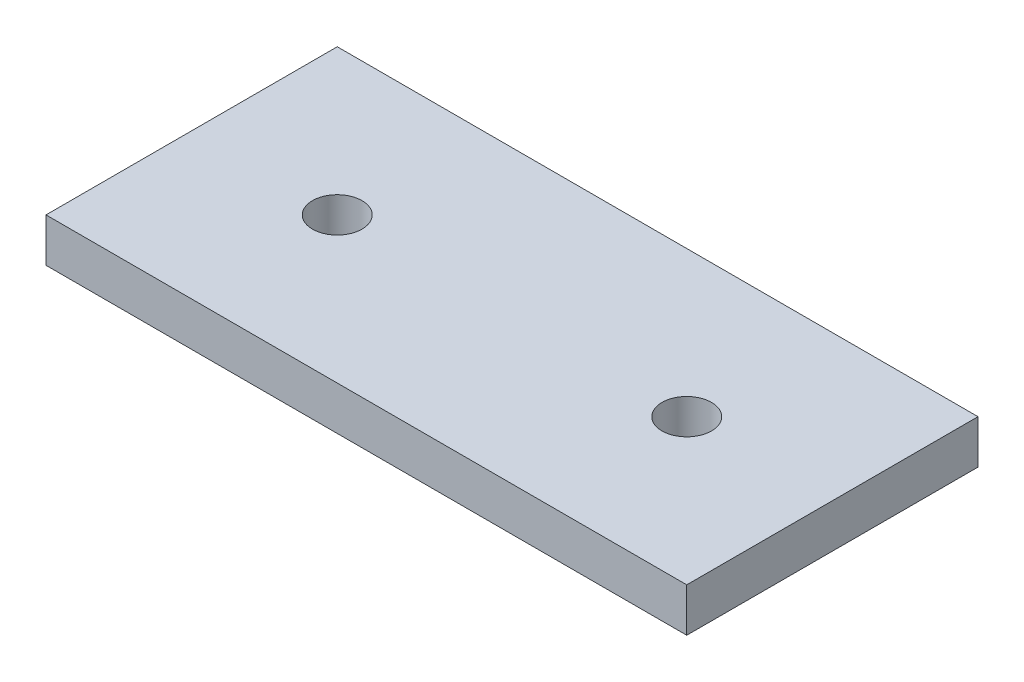
ISO-10303-21;
HEADER;
FILE_DESCRIPTION(('STEP AP214'),'2;1');
FILE_NAME('part.step','',(''),(''),'','','');
FILE_SCHEMA(('AUTOMOTIVE_DESIGN { 1 0 10303 214 1 1 1 1 }'));
ENDSEC;
DATA;
#1=APPLICATION_CONTEXT('core data for automotive mechanical design processes');
#2=APPLICATION_PROTOCOL_DEFINITION('international standard','automotive_design',2000,#1);
#3=PRODUCT_CONTEXT('',#1,'mechanical');
#4=PRODUCT('Part','Part','',(#3));
#5=PRODUCT_RELATED_PRODUCT_CATEGORY('part','',(#4));
#6=PRODUCT_DEFINITION_FORMATION('','',#4);
#7=PRODUCT_DEFINITION_CONTEXT('part definition',#1,'design');
#8=PRODUCT_DEFINITION('design','',#6,#7);
#9=PRODUCT_DEFINITION_SHAPE('','',#8);
#10=(LENGTH_UNIT() NAMED_UNIT(*) SI_UNIT(.MILLI.,.METRE.));
#11=(NAMED_UNIT(*) PLANE_ANGLE_UNIT() SI_UNIT($,.RADIAN.));
#12=(NAMED_UNIT(*) SI_UNIT($,.STERADIAN.) SOLID_ANGLE_UNIT());
#13=UNCERTAINTY_MEASURE_WITH_UNIT(LENGTH_MEASURE(1.E-05),#10,'distance_accuracy_value','');
#14=(GEOMETRIC_REPRESENTATION_CONTEXT(3) GLOBAL_UNCERTAINTY_ASSIGNED_CONTEXT((#13)) GLOBAL_UNIT_ASSIGNED_CONTEXT((#10,
#11,#12)) REPRESENTATION_CONTEXT('',''));
#15=CARTESIAN_POINT('',(0.,0.,0.));
#16=DIRECTION('',(0.,0.,1.));
#17=DIRECTION('',(1.,0.,0.));
#18=AXIS2_PLACEMENT_3D('',#15,#16,#17);
#19=CARTESIAN_POINT('',(-22.,3.,10.));
#20=DIRECTION('',(1.,0.,0.));
#21=DIRECTION('',(0.,0.,-1.));
#22=AXIS2_PLACEMENT_3D('',#19,#20,#21);
#23=PLANE('',#22);
#24=DIRECTION('',(0.,0.,1.));
#25=VECTOR('',#24,1.);
#26=CARTESIAN_POINT('',(-22.,0.,10.));
#27=LINE('',#26,#25);
#28=CARTESIAN_POINT('',(-22.,0.,-10.));
#29=VERTEX_POINT('',#28);
#30=CARTESIAN_POINT('',(-22.,0.,10.));
#31=VERTEX_POINT('',#30);
#32=EDGE_CURVE('E105',#29,#31,#27,.T.);
#33=ORIENTED_EDGE('',*,*,#32,.T.);
#34=DIRECTION('',(0.,-1.,0.));
#35=VECTOR('',#34,1.);
#36=CARTESIAN_POINT('',(-22.,3.,10.));
#37=LINE('',#36,#35);
#38=CARTESIAN_POINT('',(-22.,3.,10.));
#39=VERTEX_POINT('',#38);
#40=EDGE_CURVE('E11',#39,#31,#37,.T.);
#41=ORIENTED_EDGE('',*,*,#40,.F.);
#42=DIRECTION('',(0.,0.,1.));
#43=VECTOR('',#42,1.);
#44=CARTESIAN_POINT('',(-22.,3.,10.));
#45=LINE('',#44,#43);
#46=CARTESIAN_POINT('',(-22.,3.,-10.));
#47=VERTEX_POINT('',#46);
#48=EDGE_CURVE('E92',#47,#39,#45,.T.);
#49=ORIENTED_EDGE('',*,*,#48,.F.);
#50=DIRECTION('',(0.,-1.,0.));
#51=VECTOR('',#50,1.);
#52=CARTESIAN_POINT('',(-22.,3.,-10.));
#53=LINE('',#52,#51);
#54=EDGE_CURVE('E101',#47,#29,#53,.T.);
#55=ORIENTED_EDGE('',*,*,#54,.T.);
#56=EDGE_LOOP('',(#33,#41,#49,#55));
#57=FACE_BOUND('',#56,.T.);
#58=ADVANCED_FACE('F39',(#57),#23,.F.);
#59=CARTESIAN_POINT('',(-22.,3.,10.));
#60=DIRECTION('',(0.,0.,-1.));
#61=DIRECTION('',(-1.,0.,0.));
#62=AXIS2_PLACEMENT_3D('',#59,#60,#61);
#63=PLANE('',#62);
#64=DIRECTION('',(1.,0.,0.));
#65=VECTOR('',#64,1.);
#66=CARTESIAN_POINT('',(-22.,0.,10.));
#67=LINE('',#66,#65);
#68=CARTESIAN_POINT('',(22.,0.,10.));
#69=VERTEX_POINT('',#68);
#70=EDGE_CURVE('E96',#31,#69,#67,.T.);
#71=ORIENTED_EDGE('',*,*,#70,.T.);
#72=DIRECTION('',(0.,-1.,0.));
#73=VECTOR('',#72,1.);
#74=CARTESIAN_POINT('',(22.,3.,10.));
#75=LINE('',#74,#73);
#76=CARTESIAN_POINT('',(22.,3.,10.));
#77=VERTEX_POINT('',#76);
#78=EDGE_CURVE('E48',#77,#69,#75,.T.);
#79=ORIENTED_EDGE('',*,*,#78,.F.);
#80=DIRECTION('',(1.,0.,0.));
#81=VECTOR('',#80,1.);
#82=CARTESIAN_POINT('',(-22.,3.,10.));
#83=LINE('',#82,#81);
#84=EDGE_CURVE('E87',#39,#77,#83,.T.);
#85=ORIENTED_EDGE('',*,*,#84,.F.);
#86=ORIENTED_EDGE('',*,*,#40,.T.);
#87=EDGE_LOOP('',(#71,#79,#85,#86));
#88=FACE_BOUND('',#87,.T.);
#89=ADVANCED_FACE('F95',(#88),#63,.F.);
#90=CARTESIAN_POINT('',(22.,3.,10.));
#91=DIRECTION('',(-1.,0.,0.));
#92=DIRECTION('',(0.,0.,1.));
#93=AXIS2_PLACEMENT_3D('',#90,#91,#92);
#94=PLANE('',#93);
#95=DIRECTION('',(0.,0.,-1.));
#96=VECTOR('',#95,1.);
#97=CARTESIAN_POINT('',(22.,0.,10.));
#98=LINE('',#97,#96);
#99=CARTESIAN_POINT('',(22.,0.,-10.));
#100=VERTEX_POINT('',#99);
#101=EDGE_CURVE('E74',#69,#100,#98,.T.);
#102=ORIENTED_EDGE('',*,*,#101,.T.);
#103=DIRECTION('',(0.,-1.,0.));
#104=VECTOR('',#103,1.);
#105=CARTESIAN_POINT('',(22.,3.,-10.));
#106=LINE('',#105,#104);
#107=CARTESIAN_POINT('',(22.,3.,-10.));
#108=VERTEX_POINT('',#107);
#109=EDGE_CURVE('E97',#108,#100,#106,.T.);
#110=ORIENTED_EDGE('',*,*,#109,.F.);
#111=DIRECTION('',(0.,0.,-1.));
#112=VECTOR('',#111,1.);
#113=CARTESIAN_POINT('',(22.,3.,10.));
#114=LINE('',#113,#112);
#115=EDGE_CURVE('E90',#77,#108,#114,.T.);
#116=ORIENTED_EDGE('',*,*,#115,.F.);
#117=ORIENTED_EDGE('',*,*,#78,.T.);
#118=EDGE_LOOP('',(#102,#110,#116,#117));
#119=FACE_BOUND('',#118,.T.);
#120=ADVANCED_FACE('F99',(#119),#94,.F.);
#121=CARTESIAN_POINT('',(-22.,3.,-10.));
#122=DIRECTION('',(0.,0.,1.));
#123=DIRECTION('',(1.,0.,0.));
#124=AXIS2_PLACEMENT_3D('',#121,#122,#123);
#125=PLANE('',#124);
#126=DIRECTION('',(-1.,0.,0.));
#127=VECTOR('',#126,1.);
#128=CARTESIAN_POINT('',(-22.,0.,-10.));
#129=LINE('',#128,#127);
#130=EDGE_CURVE('E80',#100,#29,#129,.T.);
#131=ORIENTED_EDGE('',*,*,#130,.T.);
#132=ORIENTED_EDGE('',*,*,#54,.F.);
#133=DIRECTION('',(-1.,0.,0.));
#134=VECTOR('',#133,1.);
#135=CARTESIAN_POINT('',(-22.,3.,-10.));
#136=LINE('',#135,#134);
#137=EDGE_CURVE('E57',#108,#47,#136,.T.);
#138=ORIENTED_EDGE('',*,*,#137,.F.);
#139=ORIENTED_EDGE('',*,*,#109,.T.);
#140=EDGE_LOOP('',(#131,#132,#138,#139));
#141=FACE_BOUND('',#140,.T.);
#142=ADVANCED_FACE('F131',(#141),#125,.F.);
#143=CARTESIAN_POINT('',(0.,3.,0.));
#144=DIRECTION('',(0.,-1.,0.));
#145=DIRECTION('',(0.,0.,-1.));
#146=AXIS2_PLACEMENT_3D('',#143,#144,#145);
#147=PLANE('',#146);
#148=CARTESIAN_POINT('',(-12.,3.,0.));
#149=DIRECTION('',(0.,1.,0.));
#150=DIRECTION('',(0.,0.,1.));
#151=AXIS2_PLACEMENT_3D('',#148,#149,#150);
#152=CIRCLE('',#151,1.7);
#153=CARTESIAN_POINT('',(-12.,3.,1.7));
#154=VERTEX_POINT('',#153);
#155=EDGE_CURVE('E114',#154,#154,#152,.T.);
#156=ORIENTED_EDGE('',*,*,#155,.F.);
#157=EDGE_LOOP('',(#156));
#158=FACE_BOUND('',#157,.T.);
#159=CARTESIAN_POINT('',(12.,3.,0.));
#160=DIRECTION('',(0.,1.,0.));
#161=DIRECTION('',(0.,0.,1.));
#162=AXIS2_PLACEMENT_3D('',#159,#160,#161);
#163=CIRCLE('',#162,1.7);
#164=CARTESIAN_POINT('',(12.,3.,1.7));
#165=VERTEX_POINT('',#164);
#166=EDGE_CURVE('E119',#165,#165,#163,.T.);
#167=ORIENTED_EDGE('',*,*,#166,.F.);
#168=EDGE_LOOP('',(#167));
#169=FACE_BOUND('',#168,.T.);
#170=ORIENTED_EDGE('',*,*,#48,.T.);
#171=ORIENTED_EDGE('',*,*,#84,.T.);
#172=ORIENTED_EDGE('',*,*,#115,.T.);
#173=ORIENTED_EDGE('',*,*,#137,.T.);
#174=EDGE_LOOP('',(#170,#171,#172,#173));
#175=FACE_BOUND('',#174,.T.);
#176=ADVANCED_FACE('F88',(#158,#169,#175),#147,.F.);
#177=CARTESIAN_POINT('',(0.,0.,0.));
#178=DIRECTION('',(0.,-1.,0.));
#179=DIRECTION('',(0.,0.,-1.));
#180=AXIS2_PLACEMENT_3D('',#177,#178,#179);
#181=PLANE('',#180);
#182=CARTESIAN_POINT('',(-12.,0.,0.));
#183=DIRECTION('',(0.,-1.,0.));
#184=DIRECTION('',(0.,0.,-1.));
#185=AXIS2_PLACEMENT_3D('',#182,#183,#184);
#186=CIRCLE('',#185,1.7);
#187=CARTESIAN_POINT('',(-12.,0.,1.7));
#188=VERTEX_POINT('',#187);
#189=EDGE_CURVE('E42',#188,#188,#186,.T.);
#190=ORIENTED_EDGE('',*,*,#189,.F.);
#191=EDGE_LOOP('',(#190));
#192=FACE_BOUND('',#191,.T.);
#193=CARTESIAN_POINT('',(12.,0.,0.));
#194=DIRECTION('',(0.,-1.,0.));
#195=DIRECTION('',(0.,0.,-1.));
#196=AXIS2_PLACEMENT_3D('',#193,#194,#195);
#197=CIRCLE('',#196,1.7);
#198=CARTESIAN_POINT('',(12.,0.,1.7));
#199=VERTEX_POINT('',#198);
#200=EDGE_CURVE('E112',#199,#199,#197,.T.);
#201=ORIENTED_EDGE('',*,*,#200,.F.);
#202=EDGE_LOOP('',(#201));
#203=FACE_BOUND('',#202,.T.);
#204=ORIENTED_EDGE('',*,*,#32,.F.);
#205=ORIENTED_EDGE('',*,*,#130,.F.);
#206=ORIENTED_EDGE('',*,*,#101,.F.);
#207=ORIENTED_EDGE('',*,*,#70,.F.);
#208=EDGE_LOOP('',(#204,#205,#206,#207));
#209=FACE_BOUND('',#208,.T.);
#210=ADVANCED_FACE('F130',(#192,#203,#209),#181,.T.);
#211=CARTESIAN_POINT('',(12.,-1.2E-05,0.));
#212=DIRECTION('',(0.,1.,0.));
#213=DIRECTION('',(0.,0.,1.));
#214=AXIS2_PLACEMENT_3D('',#211,#212,#213);
#215=CYLINDRICAL_SURFACE('',#214,1.7);
#216=CARTESIAN_POINT('',(12.,0.,1.7));
#217=CARTESIAN_POINT('',(12.,0.03125,1.7));
#218=CARTESIAN_POINT('',(12.,0.0625,1.7));
#219=CARTESIAN_POINT('',(12.,0.125,1.7));
#220=CARTESIAN_POINT('',(12.,0.15625,1.7));
#221=CARTESIAN_POINT('',(12.,0.21875,1.7));
#222=CARTESIAN_POINT('',(12.,0.25,1.7));
#223=CARTESIAN_POINT('',(12.,0.3125,1.7));
#224=CARTESIAN_POINT('',(12.,0.34375,1.7));
#225=CARTESIAN_POINT('',(12.,0.40625,1.7));
#226=CARTESIAN_POINT('',(12.,0.4375,1.7));
#227=CARTESIAN_POINT('',(12.,0.5,1.7));
#228=CARTESIAN_POINT('',(12.,0.53125,1.7));
#229=CARTESIAN_POINT('',(12.,0.59375,1.7));
#230=CARTESIAN_POINT('',(12.,0.625,1.7));
#231=CARTESIAN_POINT('',(12.,0.6875,1.7));
#232=CARTESIAN_POINT('',(12.,0.71875,1.7));
#233=CARTESIAN_POINT('',(12.,0.78125,1.7));
#234=CARTESIAN_POINT('',(12.,0.8125,1.7));
#235=CARTESIAN_POINT('',(12.,0.875,1.7));
#236=CARTESIAN_POINT('',(12.,0.90625,1.7));
#237=CARTESIAN_POINT('',(12.,0.96875,1.7));
#238=CARTESIAN_POINT('',(12.,1.,1.7));
#239=CARTESIAN_POINT('',(12.,1.0625,1.7));
#240=CARTESIAN_POINT('',(12.,1.09375,1.7));
#241=CARTESIAN_POINT('',(12.,1.15625,1.7));
#242=CARTESIAN_POINT('',(12.,1.1875,1.7));
#243=CARTESIAN_POINT('',(12.,1.25,1.7));
#244=CARTESIAN_POINT('',(12.,1.28125,1.7));
#245=CARTESIAN_POINT('',(12.,1.34375,1.7));
#246=CARTESIAN_POINT('',(12.,1.375,1.7));
#247=CARTESIAN_POINT('',(12.,1.4375,1.7));
#248=CARTESIAN_POINT('',(12.,1.46875,1.7));
#249=CARTESIAN_POINT('',(12.,1.53125,1.7));
#250=CARTESIAN_POINT('',(12.,1.5625,1.7));
#251=CARTESIAN_POINT('',(12.,1.625,1.7));
#252=CARTESIAN_POINT('',(12.,1.65625,1.7));
#253=CARTESIAN_POINT('',(12.,1.71875,1.7));
#254=CARTESIAN_POINT('',(12.,1.75,1.7));
#255=CARTESIAN_POINT('',(12.,1.8125,1.7));
#256=CARTESIAN_POINT('',(12.,1.84375,1.7));
#257=CARTESIAN_POINT('',(12.,1.90625,1.7));
#258=CARTESIAN_POINT('',(12.,1.9375,1.7));
#259=CARTESIAN_POINT('',(12.,2.,1.7));
#260=CARTESIAN_POINT('',(12.,2.03125,1.7));
#261=CARTESIAN_POINT('',(12.,2.09375,1.7));
#262=CARTESIAN_POINT('',(12.,2.125,1.7));
#263=CARTESIAN_POINT('',(12.,2.1875,1.7));
#264=CARTESIAN_POINT('',(12.,2.21875,1.7));
#265=CARTESIAN_POINT('',(12.,2.28125,1.7));
#266=CARTESIAN_POINT('',(12.,2.3125,1.7));
#267=CARTESIAN_POINT('',(12.,2.375,1.7));
#268=CARTESIAN_POINT('',(12.,2.40625,1.7));
#269=CARTESIAN_POINT('',(12.,2.46875,1.7));
#270=CARTESIAN_POINT('',(12.,2.5,1.7));
#271=CARTESIAN_POINT('',(12.,2.5625,1.7));
#272=CARTESIAN_POINT('',(12.,2.59375,1.7));
#273=CARTESIAN_POINT('',(12.,2.65625,1.7));
#274=CARTESIAN_POINT('',(12.,2.6875,1.7));
#275=CARTESIAN_POINT('',(12.,2.75,1.7));
#276=CARTESIAN_POINT('',(12.,2.78125,1.7));
#277=CARTESIAN_POINT('',(12.,2.84375,1.7));
#278=CARTESIAN_POINT('',(12.,2.875,1.7));
#279=CARTESIAN_POINT('',(12.,2.9375,1.7));
#280=CARTESIAN_POINT('',(12.,2.96875,1.7));
#281=CARTESIAN_POINT('',(12.,3.,1.7));
#282=B_SPLINE_CURVE_WITH_KNOTS('',3,(#216,#217,#218,#219,#220,#221,#222,#223,#224,#225,#226,
#227,#228,#229,#230,#231,#232,#233,#234,#235,#236,#237,#238,#239,#240,#241,#242,#243,#244,#245,
#246,#247,#248,#249,#250,#251,#252,#253,#254,#255,#256,#257,#258,#259,#260,#261,#262,#263,#264,
#265,#266,#267,#268,#269,#270,#271,#272,#273,#274,#275,#276,#277,#278,#279,#280,#281),
.UNSPECIFIED.,.F.,.F.,(4,2,2,2,2,2,2,2,2,2,2,2,2,2,2,2,2,2,2,2,2,2,2,2,2,2,2,2,2,2,2,2,4),(0.,
0.09375,0.1875,0.28125,0.375,0.46875,0.5625,0.65625,0.75,0.84375,0.9375,1.03125,1.125,1.21875,
1.3125,1.40625,1.5,1.59375,1.6875,1.78125,1.875,1.96875,2.0625,2.15625,2.25,2.34375,2.4375,
2.53125,2.625,2.71875,2.8125,2.90625,3.),.UNSPECIFIED.);
#283=EDGE_CURVE('BSEAM127',#199,#165,#282,.T.);
#284=ORIENTED_EDGE('',*,*,#200,.T.);
#285=ORIENTED_EDGE('',*,*,#166,.T.);
#286=ORIENTED_EDGE('',*,*,#283,.T.);
#287=ORIENTED_EDGE('',*,*,#283,.F.);
#288=EDGE_LOOP('',(#284,#286,#285,#287));
#289=FACE_BOUND('',#288,.T.);
#290=ADVANCED_FACE('F127',(#289),#215,.F.);
#291=CARTESIAN_POINT('',(-12.,-1.2E-05,0.));
#292=DIRECTION('',(0.,1.,0.));
#293=DIRECTION('',(0.,0.,1.));
#294=AXIS2_PLACEMENT_3D('',#291,#292,#293);
#295=CYLINDRICAL_SURFACE('',#294,1.7);
#296=CARTESIAN_POINT('',(-12.,0.,1.7));
#297=CARTESIAN_POINT('',(-12.,0.03125,1.7));
#298=CARTESIAN_POINT('',(-12.,0.0625,1.7));
#299=CARTESIAN_POINT('',(-12.,0.125,1.7));
#300=CARTESIAN_POINT('',(-12.,0.15625,1.7));
#301=CARTESIAN_POINT('',(-12.,0.21875,1.7));
#302=CARTESIAN_POINT('',(-12.,0.25,1.7));
#303=CARTESIAN_POINT('',(-12.,0.3125,1.7));
#304=CARTESIAN_POINT('',(-12.,0.34375,1.7));
#305=CARTESIAN_POINT('',(-12.,0.40625,1.7));
#306=CARTESIAN_POINT('',(-12.,0.4375,1.7));
#307=CARTESIAN_POINT('',(-12.,0.5,1.7));
#308=CARTESIAN_POINT('',(-12.,0.53125,1.7));
#309=CARTESIAN_POINT('',(-12.,0.59375,1.7));
#310=CARTESIAN_POINT('',(-12.,0.625,1.7));
#311=CARTESIAN_POINT('',(-12.,0.6875,1.7));
#312=CARTESIAN_POINT('',(-12.,0.71875,1.7));
#313=CARTESIAN_POINT('',(-12.,0.78125,1.7));
#314=CARTESIAN_POINT('',(-12.,0.8125,1.7));
#315=CARTESIAN_POINT('',(-12.,0.875,1.7));
#316=CARTESIAN_POINT('',(-12.,0.90625,1.7));
#317=CARTESIAN_POINT('',(-12.,0.96875,1.7));
#318=CARTESIAN_POINT('',(-12.,1.,1.7));
#319=CARTESIAN_POINT('',(-12.,1.0625,1.7));
#320=CARTESIAN_POINT('',(-12.,1.09375,1.7));
#321=CARTESIAN_POINT('',(-12.,1.15625,1.7));
#322=CARTESIAN_POINT('',(-12.,1.1875,1.7));
#323=CARTESIAN_POINT('',(-12.,1.25,1.7));
#324=CARTESIAN_POINT('',(-12.,1.28125,1.7));
#325=CARTESIAN_POINT('',(-12.,1.34375,1.7));
#326=CARTESIAN_POINT('',(-12.,1.375,1.7));
#327=CARTESIAN_POINT('',(-12.,1.4375,1.7));
#328=CARTESIAN_POINT('',(-12.,1.46875,1.7));
#329=CARTESIAN_POINT('',(-12.,1.53125,1.7));
#330=CARTESIAN_POINT('',(-12.,1.5625,1.7));
#331=CARTESIAN_POINT('',(-12.,1.625,1.7));
#332=CARTESIAN_POINT('',(-12.,1.65625,1.7));
#333=CARTESIAN_POINT('',(-12.,1.71875,1.7));
#334=CARTESIAN_POINT('',(-12.,1.75,1.7));
#335=CARTESIAN_POINT('',(-12.,1.8125,1.7));
#336=CARTESIAN_POINT('',(-12.,1.84375,1.7));
#337=CARTESIAN_POINT('',(-12.,1.90625,1.7));
#338=CARTESIAN_POINT('',(-12.,1.9375,1.7));
#339=CARTESIAN_POINT('',(-12.,2.,1.7));
#340=CARTESIAN_POINT('',(-12.,2.03125,1.7));
#341=CARTESIAN_POINT('',(-12.,2.09375,1.7));
#342=CARTESIAN_POINT('',(-12.,2.125,1.7));
#343=CARTESIAN_POINT('',(-12.,2.1875,1.7));
#344=CARTESIAN_POINT('',(-12.,2.21875,1.7));
#345=CARTESIAN_POINT('',(-12.,2.28125,1.7));
#346=CARTESIAN_POINT('',(-12.,2.3125,1.7));
#347=CARTESIAN_POINT('',(-12.,2.375,1.7));
#348=CARTESIAN_POINT('',(-12.,2.40625,1.7));
#349=CARTESIAN_POINT('',(-12.,2.46875,1.7));
#350=CARTESIAN_POINT('',(-12.,2.5,1.7));
#351=CARTESIAN_POINT('',(-12.,2.5625,1.7));
#352=CARTESIAN_POINT('',(-12.,2.59375,1.7));
#353=CARTESIAN_POINT('',(-12.,2.65625,1.7));
#354=CARTESIAN_POINT('',(-12.,2.6875,1.7));
#355=CARTESIAN_POINT('',(-12.,2.75,1.7));
#356=CARTESIAN_POINT('',(-12.,2.78125,1.7));
#357=CARTESIAN_POINT('',(-12.,2.84375,1.7));
#358=CARTESIAN_POINT('',(-12.,2.875,1.7));
#359=CARTESIAN_POINT('',(-12.,2.9375,1.7));
#360=CARTESIAN_POINT('',(-12.,2.96875,1.7));
#361=CARTESIAN_POINT('',(-12.,3.,1.7));
#362=B_SPLINE_CURVE_WITH_KNOTS('',3,(#296,#297,#298,#299,#300,#301,#302,#303,#304,#305,#306,
#307,#308,#309,#310,#311,#312,#313,#314,#315,#316,#317,#318,#319,#320,#321,#322,#323,#324,#325,
#326,#327,#328,#329,#330,#331,#332,#333,#334,#335,#336,#337,#338,#339,#340,#341,#342,#343,#344,
#345,#346,#347,#348,#349,#350,#351,#352,#353,#354,#355,#356,#357,#358,#359,#360,#361),
.UNSPECIFIED.,.F.,.F.,(4,2,2,2,2,2,2,2,2,2,2,2,2,2,2,2,2,2,2,2,2,2,2,2,2,2,2,2,2,2,2,2,4),(0.,
0.09375,0.1875,0.28125,0.375,0.46875,0.5625,0.65625,0.75,0.84375,0.9375,1.03125,1.125,1.21875,
1.3125,1.40625,1.5,1.59375,1.6875,1.78125,1.875,1.96875,2.0625,2.15625,2.25,2.34375,2.4375,
2.53125,2.625,2.71875,2.8125,2.90625,3.),.UNSPECIFIED.);
#363=EDGE_CURVE('BSEAM180',#188,#154,#362,.T.);
#364=ORIENTED_EDGE('',*,*,#189,.T.);
#365=ORIENTED_EDGE('',*,*,#155,.T.);
#366=ORIENTED_EDGE('',*,*,#363,.T.);
#367=ORIENTED_EDGE('',*,*,#363,.F.);
#368=EDGE_LOOP('',(#364,#366,#365,#367));
#369=FACE_BOUND('',#368,.T.);
#370=ADVANCED_FACE('F180',(#369),#295,.F.);
#371=CLOSED_SHELL('',(#58,#89,#120,#142,#176,#210,#290,#370));
#372=MANIFOLD_SOLID_BREP('B2',#371);
#373=ADVANCED_BREP_SHAPE_REPRESENTATION('',(#18,#372),#14);
#374=SHAPE_DEFINITION_REPRESENTATION(#9,#373);
ENDSEC;
END-ISO-10303-21;
